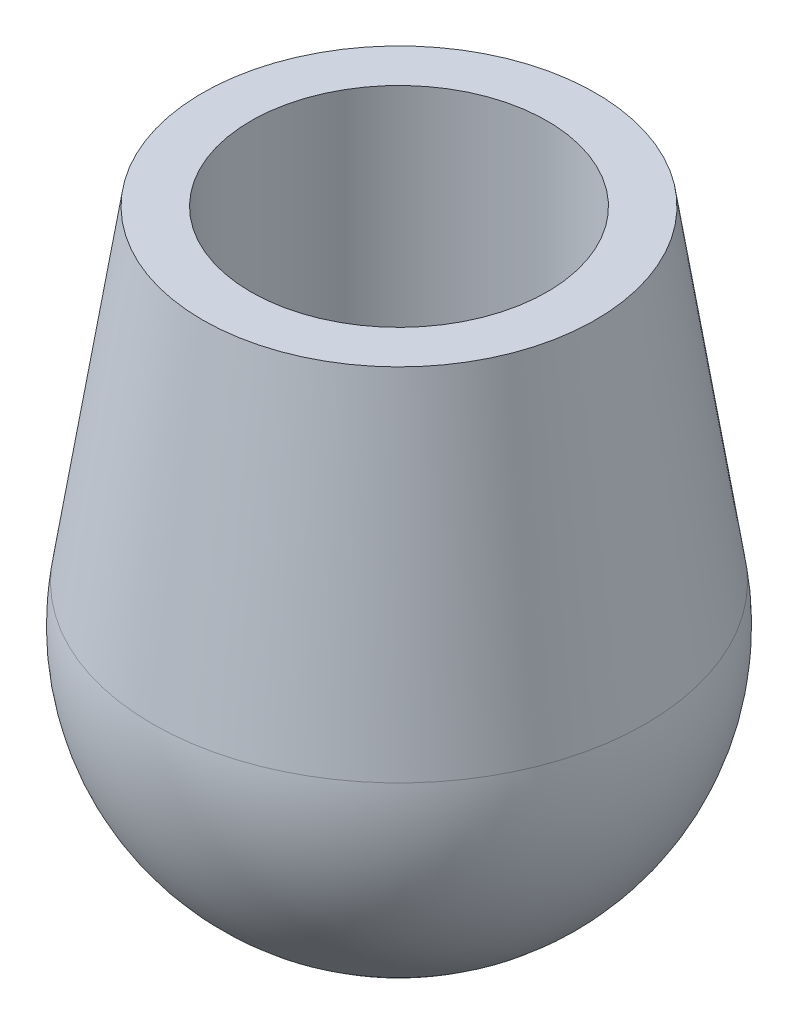
ISO-10303-21;
HEADER;
FILE_DESCRIPTION(('STEP AP214'),'2;1');
FILE_NAME('part.step','',(''),(''),'','','');
FILE_SCHEMA(('AUTOMOTIVE_DESIGN { 1 0 10303 214 1 1 1 1 }'));
ENDSEC;
DATA;
#1=APPLICATION_CONTEXT('core data for automotive mechanical design processes');
#2=APPLICATION_PROTOCOL_DEFINITION('international standard','automotive_design',2000,#1);
#3=PRODUCT_CONTEXT('',#1,'mechanical');
#4=PRODUCT('Part','Part','',(#3));
#5=PRODUCT_RELATED_PRODUCT_CATEGORY('part','',(#4));
#6=PRODUCT_DEFINITION_FORMATION('','',#4);
#7=PRODUCT_DEFINITION_CONTEXT('part definition',#1,'design');
#8=PRODUCT_DEFINITION('design','',#6,#7);
#9=PRODUCT_DEFINITION_SHAPE('','',#8);
#10=(LENGTH_UNIT() NAMED_UNIT(*) SI_UNIT(.MILLI.,.METRE.));
#11=(NAMED_UNIT(*) PLANE_ANGLE_UNIT() SI_UNIT($,.RADIAN.));
#12=(NAMED_UNIT(*) SI_UNIT($,.STERADIAN.) SOLID_ANGLE_UNIT());
#13=UNCERTAINTY_MEASURE_WITH_UNIT(LENGTH_MEASURE(1.E-05),#10,'distance_accuracy_value','');
#14=(GEOMETRIC_REPRESENTATION_CONTEXT(3) GLOBAL_UNCERTAINTY_ASSIGNED_CONTEXT((#13)) GLOBAL_UNIT_ASSIGNED_CONTEXT((#10,
#11,#12)) REPRESENTATION_CONTEXT('',''));
#15=CARTESIAN_POINT('',(0.,0.,0.));
#16=DIRECTION('',(0.,0.,1.));
#17=DIRECTION('',(1.,0.,0.));
#18=AXIS2_PLACEMENT_3D('',#15,#16,#17);
#19=CARTESIAN_POINT('',(0.,0.,0.));
#20=DIRECTION('',(0.,-1.,0.));
#21=DIRECTION('',(0.,0.,-1.));
#22=AXIS2_PLACEMENT_3D('',#19,#20,#21);
#23=PLANE('',#22);
#24=CARTESIAN_POINT('',(0.,0.,0.));
#25=DIRECTION('',(0.,1.,0.));
#26=DIRECTION('',(0.,0.,1.));
#27=AXIS2_PLACEMENT_3D('',#24,#25,#26);
#28=CIRCLE('',#27,7.65);
#29=CARTESIAN_POINT('',(0.,0.,7.65));
#30=VERTEX_POINT('',#29);
#31=EDGE_CURVE('E10',#30,#30,#28,.T.);
#32=ORIENTED_EDGE('',*,*,#31,.T.);
#33=EDGE_LOOP('',(#32));
#34=FACE_BOUND('',#33,.T.);
#35=ADVANCED_FACE('F31',(#34),#23,.F.);
#36=CARTESIAN_POINT('',(0.,0.,0.));
#37=DIRECTION('',(0.,1.,0.));
#38=DIRECTION('',(0.,0.,1.));
#39=AXIS2_PLACEMENT_3D('',#36,#37,#38);
#40=CYLINDRICAL_SURFACE('',#39,7.65);
#41=ORIENTED_EDGE('',*,*,#31,.F.);
#42=EDGE_LOOP('',(#41));
#43=FACE_BOUND('',#42,.T.);
#44=CARTESIAN_POINT('',(0.,25.,0.));
#45=DIRECTION('',(0.,1.,0.));
#46=DIRECTION('',(0.,0.,1.));
#47=AXIS2_PLACEMENT_3D('',#44,#45,#46);
#48=CIRCLE('',#47,7.65);
#49=CARTESIAN_POINT('',(0.,25.,7.65));
#50=VERTEX_POINT('',#49);
#51=EDGE_CURVE('E37',#50,#50,#48,.T.);
#52=ORIENTED_EDGE('',*,*,#51,.T.);
#53=EDGE_LOOP('',(#52));
#54=FACE_BOUND('',#53,.T.);
#55=ADVANCED_FACE('F63',(#43,#54),#40,.F.);
#56=CARTESIAN_POINT('',(7.65,25.,0.));
#57=DIRECTION('',(0.,-1.,0.));
#58=DIRECTION('',(0.,0.,-1.));
#59=AXIS2_PLACEMENT_3D('',#56,#57,#58);
#60=PLANE('',#59);
#61=ORIENTED_EDGE('',*,*,#51,.F.);
#62=EDGE_LOOP('',(#61));
#63=FACE_BOUND('',#62,.T.);
#64=CARTESIAN_POINT('',(0.,25.,0.));
#65=DIRECTION('',(0.,1.,0.));
#66=DIRECTION('',(0.,0.,1.));
#67=AXIS2_PLACEMENT_3D('',#64,#65,#66);
#68=CIRCLE('',#67,10.15);
#69=CARTESIAN_POINT('',(0.,25.,10.15));
#70=VERTEX_POINT('',#69);
#71=EDGE_CURVE('E41',#70,#70,#68,.T.);
#72=ORIENTED_EDGE('',*,*,#71,.T.);
#73=EDGE_LOOP('',(#72));
#74=FACE_BOUND('',#73,.T.);
#75=ADVANCED_FACE('F59',(#63,#74),#60,.F.);
#76=CARTESIAN_POINT('',(0.,8.21837982202149,0.));
#77=DIRECTION('',(0.,-1.,0.));
#78=DIRECTION('',(0.,0.,-1.));
#79=AXIS2_PLACEMENT_3D('',#76,#77,#78);
#80=CONICAL_SURFACE('',#79,12.7269185757283,0.15236587722409);
#81=ORIENTED_EDGE('',*,*,#71,.F.);
#82=EDGE_LOOP('',(#81));
#83=FACE_BOUND('',#82,.T.);
#84=CARTESIAN_POINT('',(0.,8.21837982202149,0.));
#85=DIRECTION('',(0.,1.,0.));
#86=DIRECTION('',(0.,0.,1.));
#87=AXIS2_PLACEMENT_3D('',#84,#85,#86);
#88=CIRCLE('',#87,12.7269185757283);
#89=CARTESIAN_POINT('',(0.,8.21837982202149,12.7269185757283));
#90=VERTEX_POINT('',#89);
#91=EDGE_CURVE('E45',#90,#90,#88,.T.);
#92=ORIENTED_EDGE('',*,*,#91,.T.);
#93=EDGE_LOOP('',(#92));
#94=FACE_BOUND('',#93,.T.);
#95=ADVANCED_FACE('F51',(#83,#94),#80,.T.);
#96=CARTESIAN_POINT('',(0.,6.2640850315452,0.));
#97=DIRECTION('',(0.,1.,0.));
#98=DIRECTION('',(1.,0.,0.));
#99=AXIS2_PLACEMENT_3D('',#96,#97,#98);
#100=SPHERICAL_SURFACE('',#99,12.8760911988577);
#101=ORIENTED_EDGE('',*,*,#91,.F.);
#102=EDGE_LOOP('',(#101));
#103=FACE_BOUND('',#102,.T.);
#104=ADVANCED_FACE('F53',(#103),#100,.T.);
#105=CLOSED_SHELL('',(#35,#55,#75,#95,#104));
#106=MANIFOLD_SOLID_BREP('B2',#105);
#107=ADVANCED_BREP_SHAPE_REPRESENTATION('',(#18,#106),#14);
#108=SHAPE_DEFINITION_REPRESENTATION(#9,#107);
ENDSEC;
END-ISO-10303-21;
